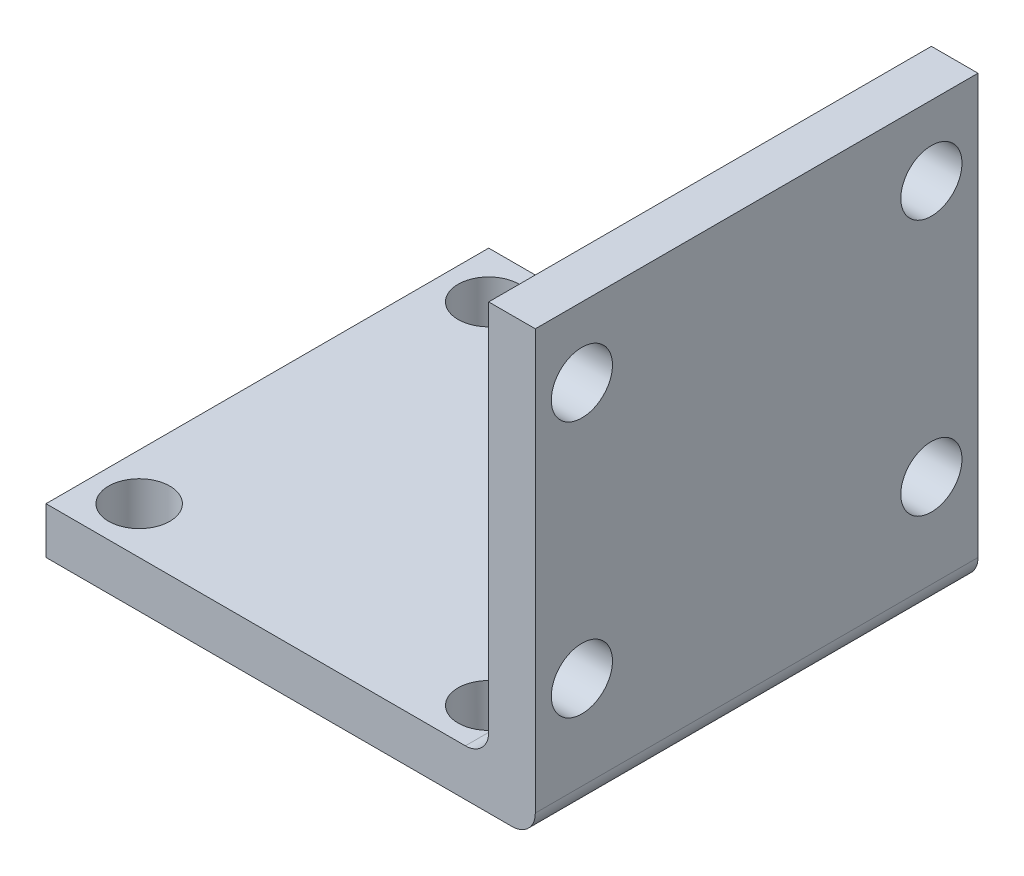
ISO-10303-21;
HEADER;
FILE_DESCRIPTION(('STEP AP214'),'2;1');
FILE_NAME('part.step','',(''),(''),'','','');
FILE_SCHEMA(('AUTOMOTIVE_DESIGN { 1 0 10303 214 1 1 1 1 }'));
ENDSEC;
DATA;
#1=APPLICATION_CONTEXT('core data for automotive mechanical design processes');
#2=APPLICATION_PROTOCOL_DEFINITION('international standard','automotive_design',2000,#1);
#3=PRODUCT_CONTEXT('',#1,'mechanical');
#4=PRODUCT('Part','Part','',(#3));
#5=PRODUCT_RELATED_PRODUCT_CATEGORY('part','',(#4));
#6=PRODUCT_DEFINITION_FORMATION('','',#4);
#7=PRODUCT_DEFINITION_CONTEXT('part definition',#1,'design');
#8=PRODUCT_DEFINITION('design','',#6,#7);
#9=PRODUCT_DEFINITION_SHAPE('','',#8);
#10=(LENGTH_UNIT() NAMED_UNIT(*) SI_UNIT(.MILLI.,.METRE.));
#11=(NAMED_UNIT(*) PLANE_ANGLE_UNIT() SI_UNIT($,.RADIAN.));
#12=(NAMED_UNIT(*) SI_UNIT($,.STERADIAN.) SOLID_ANGLE_UNIT());
#13=UNCERTAINTY_MEASURE_WITH_UNIT(LENGTH_MEASURE(1.E-05),#10,'distance_accuracy_value','');
#14=(GEOMETRIC_REPRESENTATION_CONTEXT(3) GLOBAL_UNCERTAINTY_ASSIGNED_CONTEXT((#13)) GLOBAL_UNIT_ASSIGNED_CONTEXT((#10,
#11,#12)) REPRESENTATION_CONTEXT('',''));
#15=CARTESIAN_POINT('',(0.,0.,0.));
#16=DIRECTION('',(0.,0.,1.));
#17=DIRECTION('',(1.,0.,0.));
#18=AXIS2_PLACEMENT_3D('',#15,#16,#17);
#19=CARTESIAN_POINT('',(0.,25.4,0.));
#20=DIRECTION('',(1.,0.,0.));
#21=DIRECTION('',(0.,0.,-1.));
#22=AXIS2_PLACEMENT_3D('',#19,#20,#21);
#23=PLANE('',#22);
#24=DIRECTION('',(0.,0.,1.));
#25=VECTOR('',#24,1.);
#26=CARTESIAN_POINT('',(0.,0.,0.));
#27=LINE('',#26,#25);
#28=CARTESIAN_POINT('',(0.,0.,0.));
#29=VERTEX_POINT('',#28);
#30=CARTESIAN_POINT('',(0.,0.,241.3));
#31=VERTEX_POINT('',#30);
#32=EDGE_CURVE('E224',#29,#31,#27,.T.);
#33=ORIENTED_EDGE('',*,*,#32,.T.);
#34=DIRECTION('',(0.,-1.,0.));
#35=VECTOR('',#34,1.);
#36=CARTESIAN_POINT('',(0.,25.4,241.3));
#37=LINE('',#36,#35);
#38=CARTESIAN_POINT('',(0.,25.4,241.3));
#39=VERTEX_POINT('',#38);
#40=EDGE_CURVE('E207',#39,#31,#37,.T.);
#41=ORIENTED_EDGE('',*,*,#40,.F.);
#42=DIRECTION('',(0.,0.,1.));
#43=VECTOR('',#42,1.);
#44=CARTESIAN_POINT('',(0.,25.4,0.));
#45=LINE('',#44,#43);
#46=CARTESIAN_POINT('',(0.,25.4,0.));
#47=VERTEX_POINT('',#46);
#48=EDGE_CURVE('E221',#47,#39,#45,.T.);
#49=ORIENTED_EDGE('',*,*,#48,.F.);
#50=DIRECTION('',(0.,-1.,0.));
#51=VECTOR('',#50,1.);
#52=CARTESIAN_POINT('',(0.,25.4,0.));
#53=LINE('',#52,#51);
#54=EDGE_CURVE('E215',#47,#29,#53,.T.);
#55=ORIENTED_EDGE('',*,*,#54,.T.);
#56=EDGE_LOOP('',(#33,#41,#49,#55));
#57=FACE_BOUND('',#56,.T.);
#58=ADVANCED_FACE('F33',(#57),#23,.F.);
#59=CARTESIAN_POINT('',(0.,25.4,241.3));
#60=DIRECTION('',(0.,0.,-1.));
#61=DIRECTION('',(-1.,0.,0.));
#62=AXIS2_PLACEMENT_3D('',#59,#60,#61);
#63=PLANE('',#62);
#64=DIRECTION('',(1.,0.,0.));
#65=VECTOR('',#64,1.);
#66=CARTESIAN_POINT('',(0.,0.,241.3));
#67=LINE('',#66,#65);
#68=CARTESIAN_POINT('',(254.,0.,241.3));
#69=VERTEX_POINT('',#68);
#70=EDGE_CURVE('E222',#31,#69,#67,.T.);
#71=ORIENTED_EDGE('',*,*,#70,.T.);
#72=CARTESIAN_POINT('',(254.,12.7,241.3));
#73=DIRECTION('',(0.,0.,-1.));
#74=DIRECTION('',(-1.,0.,0.));
#75=AXIS2_PLACEMENT_3D('',#72,#73,#74);
#76=CIRCLE('',#75,12.7);
#77=CARTESIAN_POINT('',(266.7,12.7,241.3));
#78=VERTEX_POINT('',#77);
#79=EDGE_CURVE('E131',#69,#78,#76,.F.);
#80=ORIENTED_EDGE('',*,*,#79,.T.);
#81=DIRECTION('',(0.,-1.,0.));
#82=VECTOR('',#81,1.);
#83=CARTESIAN_POINT('',(266.7,25.4,241.3));
#84=LINE('',#83,#82);
#85=CARTESIAN_POINT('',(266.7,241.3,241.3));
#86=VERTEX_POINT('',#85);
#87=EDGE_CURVE('E210',#86,#78,#84,.T.);
#88=ORIENTED_EDGE('',*,*,#87,.F.);
#89=DIRECTION('',(1.,0.,0.));
#90=VECTOR('',#89,1.);
#91=CARTESIAN_POINT('',(266.7,241.3,241.3));
#92=LINE('',#91,#90);
#93=CARTESIAN_POINT('',(241.3,241.3,241.3));
#94=VERTEX_POINT('',#93);
#95=EDGE_CURVE('E237',#94,#86,#92,.T.);
#96=ORIENTED_EDGE('',*,*,#95,.F.);
#97=DIRECTION('',(0.,-1.,0.));
#98=VECTOR('',#97,1.);
#99=CARTESIAN_POINT('',(241.3,241.3,241.3));
#100=LINE('',#99,#98);
#101=CARTESIAN_POINT('',(241.3,38.1,241.3));
#102=VERTEX_POINT('',#101);
#103=EDGE_CURVE('E235',#94,#102,#100,.T.);
#104=ORIENTED_EDGE('',*,*,#103,.T.);
#105=CARTESIAN_POINT('',(228.6,38.1,241.3));
#106=DIRECTION('',(0.,0.,-1.));
#107=DIRECTION('',(-1.,0.,0.));
#108=AXIS2_PLACEMENT_3D('',#105,#106,#107);
#109=CIRCLE('',#108,12.7);
#110=CARTESIAN_POINT('',(228.6,25.4,241.3));
#111=VERTEX_POINT('',#110);
#112=EDGE_CURVE('E135',#102,#111,#109,.T.);
#113=ORIENTED_EDGE('',*,*,#112,.T.);
#114=DIRECTION('',(1.,0.,0.));
#115=VECTOR('',#114,1.);
#116=CARTESIAN_POINT('',(0.,25.4,241.3));
#117=LINE('',#116,#115);
#118=EDGE_CURVE('E229',#39,#111,#117,.T.);
#119=ORIENTED_EDGE('',*,*,#118,.F.);
#120=ORIENTED_EDGE('',*,*,#40,.T.);
#121=EDGE_LOOP('',(#71,#80,#88,#96,#104,#113,#119,#120));
#122=FACE_BOUND('',#121,.T.);
#123=ADVANCED_FACE('F182',(#122),#63,.F.);
#124=CARTESIAN_POINT('',(266.7,25.4,0.));
#125=DIRECTION('',(-1.,0.,0.));
#126=DIRECTION('',(0.,0.,1.));
#127=AXIS2_PLACEMENT_3D('',#124,#125,#126);
#128=PLANE('',#127);
#129=CARTESIAN_POINT('',(266.7,203.2,25.4));
#130=DIRECTION('',(-1.,0.,0.));
#131=DIRECTION('',(0.,0.,1.));
#132=AXIS2_PLACEMENT_3D('',#129,#130,#131);
#133=CIRCLE('',#132,16.6751);
#134=CARTESIAN_POINT('',(266.7,203.2,42.0751));
#135=VERTEX_POINT('',#134);
#136=EDGE_CURVE('E275',#135,#135,#133,.T.);
#137=ORIENTED_EDGE('',*,*,#136,.T.);
#138=EDGE_LOOP('',(#137));
#139=FACE_BOUND('',#138,.T.);
#140=CARTESIAN_POINT('',(266.7,63.5,215.9));
#141=DIRECTION('',(-1.,0.,0.));
#142=DIRECTION('',(0.,0.,1.));
#143=AXIS2_PLACEMENT_3D('',#140,#141,#142);
#144=CIRCLE('',#143,16.6751);
#145=CARTESIAN_POINT('',(266.7,63.5,232.5751));
#146=VERTEX_POINT('',#145);
#147=EDGE_CURVE('E272',#146,#146,#144,.T.);
#148=ORIENTED_EDGE('',*,*,#147,.T.);
#149=EDGE_LOOP('',(#148));
#150=FACE_BOUND('',#149,.T.);
#151=CARTESIAN_POINT('',(266.7,203.2,215.9));
#152=DIRECTION('',(-1.,0.,0.));
#153=DIRECTION('',(0.,0.,1.));
#154=AXIS2_PLACEMENT_3D('',#151,#152,#153);
#155=CIRCLE('',#154,16.6751);
#156=CARTESIAN_POINT('',(266.7,203.2,232.5751));
#157=VERTEX_POINT('',#156);
#158=EDGE_CURVE('E269',#157,#157,#155,.T.);
#159=ORIENTED_EDGE('',*,*,#158,.T.);
#160=EDGE_LOOP('',(#159));
#161=FACE_BOUND('',#160,.T.);
#162=CARTESIAN_POINT('',(266.7,63.5,25.4));
#163=DIRECTION('',(-1.,0.,0.));
#164=DIRECTION('',(0.,0.,1.));
#165=AXIS2_PLACEMENT_3D('',#162,#163,#164);
#166=CIRCLE('',#165,16.6751);
#167=CARTESIAN_POINT('',(266.7,63.5,42.0751));
#168=VERTEX_POINT('',#167);
#169=EDGE_CURVE('E266',#168,#168,#166,.T.);
#170=ORIENTED_EDGE('',*,*,#169,.T.);
#171=EDGE_LOOP('',(#170));
#172=FACE_BOUND('',#171,.T.);
#173=ORIENTED_EDGE('',*,*,#87,.T.);
#174=DIRECTION('',(0.,0.,-1.));
#175=VECTOR('',#174,1.);
#176=CARTESIAN_POINT('',(266.7,12.7,0.));
#177=LINE('',#176,#175);
#178=CARTESIAN_POINT('',(266.7,12.7,0.));
#179=VERTEX_POINT('',#178);
#180=EDGE_CURVE('E198',#78,#179,#177,.T.);
#181=ORIENTED_EDGE('',*,*,#180,.T.);
#182=DIRECTION('',(0.,-1.,0.));
#183=VECTOR('',#182,1.);
#184=CARTESIAN_POINT('',(266.7,25.4,0.));
#185=LINE('',#184,#183);
#186=CARTESIAN_POINT('',(266.7,241.3,0.));
#187=VERTEX_POINT('',#186);
#188=EDGE_CURVE('E212',#187,#179,#185,.T.);
#189=ORIENTED_EDGE('',*,*,#188,.F.);
#190=DIRECTION('',(0.,0.,-1.));
#191=VECTOR('',#190,1.);
#192=CARTESIAN_POINT('',(266.7,241.3,0.));
#193=LINE('',#192,#191);
#194=EDGE_CURVE('E244',#86,#187,#193,.T.);
#195=ORIENTED_EDGE('',*,*,#194,.F.);
#196=EDGE_LOOP('',(#173,#181,#189,#195));
#197=FACE_BOUND('',#196,.T.);
#198=ADVANCED_FACE('F178',(#139,#150,#161,#172,#197),#128,.F.);
#199=CARTESIAN_POINT('',(0.,25.4,0.));
#200=DIRECTION('',(0.,0.,1.));
#201=DIRECTION('',(1.,0.,0.));
#202=AXIS2_PLACEMENT_3D('',#199,#200,#201);
#203=PLANE('',#202);
#204=ORIENTED_EDGE('',*,*,#188,.T.);
#205=CARTESIAN_POINT('',(254.,12.7,0.));
#206=DIRECTION('',(0.,0.,1.));
#207=DIRECTION('',(1.,0.,0.));
#208=AXIS2_PLACEMENT_3D('',#205,#206,#207);
#209=CIRCLE('',#208,12.7);
#210=CARTESIAN_POINT('',(254.,0.,0.));
#211=VERTEX_POINT('',#210);
#212=EDGE_CURVE('E202',#179,#211,#209,.F.);
#213=ORIENTED_EDGE('',*,*,#212,.T.);
#214=DIRECTION('',(-1.,0.,0.));
#215=VECTOR('',#214,1.);
#216=CARTESIAN_POINT('',(0.,0.,0.));
#217=LINE('',#216,#215);
#218=EDGE_CURVE('E219',#211,#29,#217,.T.);
#219=ORIENTED_EDGE('',*,*,#218,.T.);
#220=ORIENTED_EDGE('',*,*,#54,.F.);
#221=DIRECTION('',(-1.,0.,0.));
#222=VECTOR('',#221,1.);
#223=CARTESIAN_POINT('',(0.,25.4,0.));
#224=LINE('',#223,#222);
#225=CARTESIAN_POINT('',(228.6,25.4,0.));
#226=VERTEX_POINT('',#225);
#227=EDGE_CURVE('E218',#226,#47,#224,.T.);
#228=ORIENTED_EDGE('',*,*,#227,.F.);
#229=CARTESIAN_POINT('',(228.6,38.1,0.));
#230=DIRECTION('',(0.,0.,1.));
#231=DIRECTION('',(1.,0.,0.));
#232=AXIS2_PLACEMENT_3D('',#229,#230,#231);
#233=CIRCLE('',#232,12.7);
#234=CARTESIAN_POINT('',(241.3,38.1,0.));
#235=VERTEX_POINT('',#234);
#236=EDGE_CURVE('E115',#226,#235,#233,.T.);
#237=ORIENTED_EDGE('',*,*,#236,.T.);
#238=DIRECTION('',(0.,-1.,0.));
#239=VECTOR('',#238,1.);
#240=CARTESIAN_POINT('',(241.3,241.3,0.));
#241=LINE('',#240,#239);
#242=CARTESIAN_POINT('',(241.3,241.3,0.));
#243=VERTEX_POINT('',#242);
#244=EDGE_CURVE('E227',#243,#235,#241,.T.);
#245=ORIENTED_EDGE('',*,*,#244,.F.);
#246=DIRECTION('',(-1.,0.,0.));
#247=VECTOR('',#246,1.);
#248=CARTESIAN_POINT('',(266.7,241.3,0.));
#249=LINE('',#248,#247);
#250=EDGE_CURVE('E242',#187,#243,#249,.T.);
#251=ORIENTED_EDGE('',*,*,#250,.F.);
#252=EDGE_LOOP('',(#204,#213,#219,#220,#228,#237,#245,#251));
#253=FACE_BOUND('',#252,.T.);
#254=ADVANCED_FACE('F172',(#253),#203,.F.);
#255=CARTESIAN_POINT('',(0.,25.4,0.));
#256=DIRECTION('',(0.,1.,0.));
#257=DIRECTION('',(0.,0.,1.));
#258=AXIS2_PLACEMENT_3D('',#255,#256,#257);
#259=PLANE('',#258);
#260=CARTESIAN_POINT('',(215.9,25.4,215.9));
#261=DIRECTION('',(0.,1.,0.));
#262=DIRECTION('',(0.,0.,1.));
#263=AXIS2_PLACEMENT_3D('',#260,#261,#262);
#264=CIRCLE('',#263,16.6751);
#265=CARTESIAN_POINT('',(228.6,25.4,205.094031278502));
#266=VERTEX_POINT('',#265);
#267=CARTESIAN_POINT('',(228.6,25.4,226.705968721498));
#268=VERTEX_POINT('',#267);
#269=EDGE_CURVE('E57',#266,#268,#264,.T.);
#270=ORIENTED_EDGE('',*,*,#269,.F.);
#271=DIRECTION('',(0.,0.,1.));
#272=VECTOR('',#271,1.);
#273=CARTESIAN_POINT('',(228.6,25.4,0.));
#274=LINE('',#273,#272);
#275=CARTESIAN_POINT('',(228.6,25.4,36.2059687214983));
#276=VERTEX_POINT('',#275);
#277=EDGE_CURVE('E122',#266,#276,#274,.F.);
#278=ORIENTED_EDGE('',*,*,#277,.T.);
#279=CARTESIAN_POINT('',(215.9,25.4,25.4));
#280=DIRECTION('',(0.,1.,0.));
#281=DIRECTION('',(0.,0.,1.));
#282=AXIS2_PLACEMENT_3D('',#279,#280,#281);
#283=CIRCLE('',#282,16.6751);
#284=CARTESIAN_POINT('',(228.6,25.4,14.5940312785017));
#285=VERTEX_POINT('',#284);
#286=EDGE_CURVE('E50',#285,#276,#283,.T.);
#287=ORIENTED_EDGE('',*,*,#286,.F.);
#288=EDGE_CURVE('E120',#285,#226,#274,.F.);
#289=ORIENTED_EDGE('',*,*,#288,.T.);
#290=ORIENTED_EDGE('',*,*,#227,.T.);
#291=ORIENTED_EDGE('',*,*,#48,.T.);
#292=ORIENTED_EDGE('',*,*,#118,.T.);
#293=EDGE_CURVE('E129',#111,#268,#274,.F.);
#294=ORIENTED_EDGE('',*,*,#293,.T.);
#295=EDGE_LOOP('',(#270,#278,#287,#289,#290,#291,#292,#294));
#296=FACE_BOUND('',#295,.T.);
#297=CARTESIAN_POINT('',(25.3999999999999,25.4,25.4));
#298=DIRECTION('',(0.,1.,0.));
#299=DIRECTION('',(0.,0.,1.));
#300=AXIS2_PLACEMENT_3D('',#297,#298,#299);
#301=CIRCLE('',#300,16.6751);
#302=CARTESIAN_POINT('',(25.3999999999999,25.4,42.0751));
#303=VERTEX_POINT('',#302);
#304=EDGE_CURVE('E253',#303,#303,#301,.T.);
#305=ORIENTED_EDGE('',*,*,#304,.F.);
#306=EDGE_LOOP('',(#305));
#307=FACE_BOUND('',#306,.T.);
#308=CARTESIAN_POINT('',(25.3999999999999,25.4,215.9));
#309=DIRECTION('',(0.,1.,0.));
#310=DIRECTION('',(0.,0.,1.));
#311=AXIS2_PLACEMENT_3D('',#308,#309,#310);
#312=CIRCLE('',#311,16.6751);
#313=CARTESIAN_POINT('',(25.3999999999999,25.4,232.5751));
#314=VERTEX_POINT('',#313);
#315=EDGE_CURVE('E247',#314,#314,#312,.T.);
#316=ORIENTED_EDGE('',*,*,#315,.F.);
#317=EDGE_LOOP('',(#316));
#318=FACE_BOUND('',#317,.T.);
#319=ADVANCED_FACE('F118',(#296,#307,#318),#259,.T.);
#320=CARTESIAN_POINT('',(0.,0.,0.));
#321=DIRECTION('',(0.,1.,0.));
#322=DIRECTION('',(0.,0.,1.));
#323=AXIS2_PLACEMENT_3D('',#320,#321,#322);
#324=PLANE('',#323);
#325=CARTESIAN_POINT('',(215.9,0.,215.9));
#326=DIRECTION('',(0.,1.,0.));
#327=DIRECTION('',(0.,0.,1.));
#328=AXIS2_PLACEMENT_3D('',#325,#326,#327);
#329=CIRCLE('',#328,16.6751);
#330=CARTESIAN_POINT('',(215.9,0.,232.5751));
#331=VERTEX_POINT('',#330);
#332=EDGE_CURVE('E123',#331,#331,#329,.T.);
#333=ORIENTED_EDGE('',*,*,#332,.T.);
#334=EDGE_LOOP('',(#333));
#335=FACE_BOUND('',#334,.T.);
#336=CARTESIAN_POINT('',(25.3999999999999,0.,25.4));
#337=DIRECTION('',(0.,1.,0.));
#338=DIRECTION('',(0.,0.,1.));
#339=AXIS2_PLACEMENT_3D('',#336,#337,#338);
#340=CIRCLE('',#339,16.6751);
#341=CARTESIAN_POINT('',(25.3999999999999,0.,42.0751));
#342=VERTEX_POINT('',#341);
#343=EDGE_CURVE('E260',#342,#342,#340,.T.);
#344=ORIENTED_EDGE('',*,*,#343,.T.);
#345=EDGE_LOOP('',(#344));
#346=FACE_BOUND('',#345,.T.);
#347=CARTESIAN_POINT('',(215.9,0.,25.4));
#348=DIRECTION('',(0.,1.,0.));
#349=DIRECTION('',(0.,0.,1.));
#350=AXIS2_PLACEMENT_3D('',#347,#348,#349);
#351=CIRCLE('',#350,16.6751);
#352=CARTESIAN_POINT('',(215.9,0.,42.0751));
#353=VERTEX_POINT('',#352);
#354=EDGE_CURVE('E257',#353,#353,#351,.T.);
#355=ORIENTED_EDGE('',*,*,#354,.T.);
#356=EDGE_LOOP('',(#355));
#357=FACE_BOUND('',#356,.T.);
#358=CARTESIAN_POINT('',(25.3999999999999,0.,215.9));
#359=DIRECTION('',(0.,1.,0.));
#360=DIRECTION('',(0.,0.,1.));
#361=AXIS2_PLACEMENT_3D('',#358,#359,#360);
#362=CIRCLE('',#361,16.6751);
#363=CARTESIAN_POINT('',(25.3999999999999,0.,232.5751));
#364=VERTEX_POINT('',#363);
#365=EDGE_CURVE('E250',#364,#364,#362,.T.);
#366=ORIENTED_EDGE('',*,*,#365,.T.);
#367=EDGE_LOOP('',(#366));
#368=FACE_BOUND('',#367,.T.);
#369=ORIENTED_EDGE('',*,*,#218,.F.);
#370=DIRECTION('',(0.,0.,-1.));
#371=VECTOR('',#370,1.);
#372=CARTESIAN_POINT('',(254.,0.,0.));
#373=LINE('',#372,#371);
#374=EDGE_CURVE('E196',#211,#69,#373,.F.);
#375=ORIENTED_EDGE('',*,*,#374,.T.);
#376=ORIENTED_EDGE('',*,*,#70,.F.);
#377=ORIENTED_EDGE('',*,*,#32,.F.);
#378=EDGE_LOOP('',(#369,#375,#376,#377));
#379=FACE_BOUND('',#378,.T.);
#380=ADVANCED_FACE('F168',(#335,#346,#357,#368,#379),#324,.F.);
#381=CARTESIAN_POINT('',(241.3,241.3,0.));
#382=DIRECTION('',(1.,0.,0.));
#383=DIRECTION('',(0.,0.,-1.));
#384=AXIS2_PLACEMENT_3D('',#381,#382,#383);
#385=PLANE('',#384);
#386=CARTESIAN_POINT('',(241.3,203.2,25.4));
#387=DIRECTION('',(1.,0.,0.));
#388=DIRECTION('',(0.,0.,-1.));
#389=AXIS2_PLACEMENT_3D('',#386,#387,#388);
#390=CIRCLE('',#389,16.6751);
#391=CARTESIAN_POINT('',(241.3,203.2,8.72489999999997));
#392=VERTEX_POINT('',#391);
#393=EDGE_CURVE('E38',#392,#392,#390,.T.);
#394=ORIENTED_EDGE('',*,*,#393,.T.);
#395=EDGE_LOOP('',(#394));
#396=FACE_BOUND('',#395,.T.);
#397=CARTESIAN_POINT('',(241.3,63.5,215.9));
#398=DIRECTION('',(1.,0.,0.));
#399=DIRECTION('',(0.,0.,-1.));
#400=AXIS2_PLACEMENT_3D('',#397,#398,#399);
#401=CIRCLE('',#400,16.6751);
#402=CARTESIAN_POINT('',(241.3,63.5,199.2249));
#403=VERTEX_POINT('',#402);
#404=EDGE_CURVE('E280',#403,#403,#401,.T.);
#405=ORIENTED_EDGE('',*,*,#404,.T.);
#406=EDGE_LOOP('',(#405));
#407=FACE_BOUND('',#406,.T.);
#408=CARTESIAN_POINT('',(241.3,203.2,215.9));
#409=DIRECTION('',(1.,0.,0.));
#410=DIRECTION('',(0.,0.,-1.));
#411=AXIS2_PLACEMENT_3D('',#408,#409,#410);
#412=CIRCLE('',#411,16.6751);
#413=CARTESIAN_POINT('',(241.3,203.2,199.2249));
#414=VERTEX_POINT('',#413);
#415=EDGE_CURVE('E277',#414,#414,#412,.T.);
#416=ORIENTED_EDGE('',*,*,#415,.T.);
#417=EDGE_LOOP('',(#416));
#418=FACE_BOUND('',#417,.T.);
#419=CARTESIAN_POINT('',(241.3,63.5,25.4));
#420=DIRECTION('',(1.,0.,0.));
#421=DIRECTION('',(0.,0.,-1.));
#422=AXIS2_PLACEMENT_3D('',#419,#420,#421);
#423=CIRCLE('',#422,16.6751);
#424=CARTESIAN_POINT('',(241.3,63.5,8.72489999999997));
#425=VERTEX_POINT('',#424);
#426=EDGE_CURVE('E261',#425,#425,#423,.T.);
#427=ORIENTED_EDGE('',*,*,#426,.T.);
#428=EDGE_LOOP('',(#427));
#429=FACE_BOUND('',#428,.T.);
#430=ORIENTED_EDGE('',*,*,#244,.T.);
#431=DIRECTION('',(0.,0.,1.));
#432=VECTOR('',#431,1.);
#433=CARTESIAN_POINT('',(241.3,38.1,0.));
#434=LINE('',#433,#432);
#435=EDGE_CURVE('E127',#235,#102,#434,.T.);
#436=ORIENTED_EDGE('',*,*,#435,.T.);
#437=ORIENTED_EDGE('',*,*,#103,.F.);
#438=DIRECTION('',(0.,0.,1.));
#439=VECTOR('',#438,1.);
#440=CARTESIAN_POINT('',(241.3,241.3,0.));
#441=LINE('',#440,#439);
#442=EDGE_CURVE('E240',#243,#94,#441,.T.);
#443=ORIENTED_EDGE('',*,*,#442,.F.);
#444=EDGE_LOOP('',(#430,#436,#437,#443));
#445=FACE_BOUND('',#444,.T.);
#446=ADVANCED_FACE('F164',(#396,#407,#418,#429,#445),#385,.F.);
#447=CARTESIAN_POINT('',(0.,241.3,0.));
#448=DIRECTION('',(0.,-1.,0.));
#449=DIRECTION('',(0.,0.,-1.));
#450=AXIS2_PLACEMENT_3D('',#447,#448,#449);
#451=PLANE('',#450);
#452=ORIENTED_EDGE('',*,*,#194,.T.);
#453=ORIENTED_EDGE('',*,*,#250,.T.);
#454=ORIENTED_EDGE('',*,*,#442,.T.);
#455=ORIENTED_EDGE('',*,*,#95,.T.);
#456=EDGE_LOOP('',(#452,#453,#454,#455));
#457=FACE_BOUND('',#456,.T.);
#458=ADVANCED_FACE('F160',(#457),#451,.F.);
#459=CARTESIAN_POINT('',(254.,12.7,0.));
#460=DIRECTION('',(0.,0.,-1.));
#461=DIRECTION('',(-1.,0.,0.));
#462=AXIS2_PLACEMENT_3D('',#459,#460,#461);
#463=CYLINDRICAL_SURFACE('',#462,12.7);
#464=ORIENTED_EDGE('',*,*,#79,.F.);
#465=ORIENTED_EDGE('',*,*,#374,.F.);
#466=ORIENTED_EDGE('',*,*,#212,.F.);
#467=ORIENTED_EDGE('',*,*,#180,.F.);
#468=EDGE_LOOP('',(#464,#465,#466,#467));
#469=FACE_BOUND('',#468,.T.);
#470=ADVANCED_FACE('F163',(#469),#463,.T.);
#471=CARTESIAN_POINT('',(228.6,38.1,0.));
#472=DIRECTION('',(0.,0.,1.));
#473=DIRECTION('',(1.,0.,0.));
#474=AXIS2_PLACEMENT_3D('',#471,#472,#473);
#475=CYLINDRICAL_SURFACE('',#474,12.7);
#476=ORIENTED_EDGE('',*,*,#277,.F.);
#477=CARTESIAN_POINT('',(228.6,25.4,205.094031278502));
#478=CARTESIAN_POINT('',(228.748638665477,25.4000028529839,205.268720481792));
#479=CARTESIAN_POINT('',(228.893641599045,25.4026091280366,205.446445185434));
#480=CARTESIAN_POINT('',(229.176121334364,25.4122867272648,205.807621020647));
#481=CARTESIAN_POINT('',(229.313599252627,25.4193573870824,205.991071296319));
#482=CARTESIAN_POINT('',(229.714189917119,25.4461389695309,206.549240923372));
#483=CARTESIAN_POINT('',(229.965725615038,25.4714221514406,206.932091924292));
#484=CARTESIAN_POINT('',(230.436303070059,25.5312166301806,207.716820780886));
#485=CARTESIAN_POINT('',(230.655322160142,25.5657343177668,208.11871165403));
#486=CARTESIAN_POINT('',(231.059524359963,25.6387428642707,208.938907340355));
#487=CARTESIAN_POINT('',(231.244701530351,25.6772344187614,209.357215019112));
#488=CARTESIAN_POINT('',(231.579903002101,25.7533525110392,210.207191251521));
#489=CARTESIAN_POINT('',(231.729968068196,25.7909800057351,210.638843646017));
#490=CARTESIAN_POINT('',(231.994255755082,25.8612196141729,211.513370425346));
#491=CARTESIAN_POINT('',(232.108480698626,25.8938320528641,211.956244080933));
#492=CARTESIAN_POINT('',(232.300125220008,25.9505525646391,212.849854257006));
#493=CARTESIAN_POINT('',(232.377590973873,25.9746712974368,213.300580171453));
#494=CARTESIAN_POINT('',(232.495265039619,26.0119588289649,214.207329993587));
#495=CARTESIAN_POINT('',(232.535473739743,26.0251277417995,214.663353846016));
#496=CARTESIAN_POINT('',(232.578387557448,26.0391974271138,215.580209995312));
#497=CARTESIAN_POINT('',(232.580857450689,26.0400212525898,216.041054548804));
#498=CARTESIAN_POINT('',(232.547664393457,26.029115907248,216.961223174793));
#499=CARTESIAN_POINT('',(232.512000563252,26.0173864468304,217.420547211967));
#500=CARTESIAN_POINT('',(232.402808129745,25.9825778758677,218.334864993382));
#501=CARTESIAN_POINT('',(232.329227285688,25.959483108575,218.789851878886));
#502=CARTESIAN_POINT('',(232.144823690641,25.9043671872923,219.691632449904));
#503=CARTESIAN_POINT('',(232.034001888139,25.8723462606457,220.138426343779));
#504=CARTESIAN_POINT('',(231.778375654418,25.8034520074323,221.012701735599));
#505=CARTESIAN_POINT('',(231.634242125681,25.7666800904956,221.440387905527));
#506=CARTESIAN_POINT('',(231.311820760031,25.6918009320959,222.282640516887));
#507=CARTESIAN_POINT('',(231.133527862663,25.6536934934696,222.697205003822));
#508=CARTESIAN_POINT('',(230.744245759307,25.5807615662333,223.509854892572));
#509=CARTESIAN_POINT('',(230.533329374486,25.5459300371214,223.907974553414));
#510=CARTESIAN_POINT('',(230.079746437603,25.4844272644689,224.686146514816));
#511=CARTESIAN_POINT('',(229.837098485734,25.4577512707126,225.066209223319));
#512=CARTESIAN_POINT('',(229.426432791498,25.4259906799266,225.655310174803));
#513=CARTESIAN_POINT('',(229.268226686913,25.4165372279823,225.871007663655));
#514=CARTESIAN_POINT('',(228.941657349455,25.403546808939,226.294499087156));
#515=CARTESIAN_POINT('',(228.773301619342,25.4000055257135,226.502298679194));
#516=CARTESIAN_POINT('',(228.6,25.4,226.705968721498));
#517=B_SPLINE_CURVE_WITH_KNOTS('',3,(#477,#478,#479,#480,#481,#482,#483,#484,#485,#486,#487,
#488,#489,#490,#491,#492,#493,#494,#495,#496,#497,#498,#499,#500,#501,#502,#503,#504,#505,#506,
#507,#508,#509,#510,#511,#512,#513,#514,#515,#516),.UNSPECIFIED.,.F.,.F.,(4,2,2,2,2,2,2,2,2,2,2,
2,2,2,2,2,2,2,2,4),(0.,0.68796204313846,1.37582173280543,2.75031355056788,4.12575905953246,
5.50144573159646,6.87552723381388,8.24951966517272,9.62178152044119,10.9940290756549,
12.3748263253893,13.7556554303254,15.1383921009144,16.5210935573537,17.8780591439276,
19.2352259105126,20.589405842026,21.9427955181016,22.7454465519304,23.5475113608264),.UNSPECIFIED.);
#518=EDGE_CURVE('E11',#266,#268,#517,.T.);
#519=ORIENTED_EDGE('',*,*,#518,.T.);
#520=ORIENTED_EDGE('',*,*,#293,.F.);
#521=ORIENTED_EDGE('',*,*,#112,.F.);
#522=ORIENTED_EDGE('',*,*,#435,.F.);
#523=ORIENTED_EDGE('',*,*,#236,.F.);
#524=ORIENTED_EDGE('',*,*,#288,.F.);
#525=CARTESIAN_POINT('',(228.6,25.4,14.5940312785017));
#526=CARTESIAN_POINT('',(228.748638665477,25.4000028529839,14.7687204817919));
#527=CARTESIAN_POINT('',(228.893641599045,25.4026091280366,14.9464451854335));
#528=CARTESIAN_POINT('',(229.176121334364,25.4122867272648,15.3076210206468));
#529=CARTESIAN_POINT('',(229.313599252627,25.4193573870824,15.4910712963192));
#530=CARTESIAN_POINT('',(229.714189917119,25.4461389695309,16.0492409233721));
#531=CARTESIAN_POINT('',(229.965725615038,25.4714221514406,16.4320919242916));
#532=CARTESIAN_POINT('',(230.436303070059,25.5312166301806,17.2168207808862));
#533=CARTESIAN_POINT('',(230.655322160142,25.5657343177668,17.6187116540301));
#534=CARTESIAN_POINT('',(231.059524359963,25.6387428642707,18.4389073403552));
#535=CARTESIAN_POINT('',(231.244701530351,25.6772344187614,18.8572150191119));
#536=CARTESIAN_POINT('',(231.579903002101,25.7533525110392,19.707191251521));
#537=CARTESIAN_POINT('',(231.729968068196,25.7909800057351,20.1388436460168));
#538=CARTESIAN_POINT('',(231.994255755082,25.8612196141729,21.0133704253462));
#539=CARTESIAN_POINT('',(232.108480698626,25.8938320528641,21.4562440809329));
#540=CARTESIAN_POINT('',(232.300125220008,25.9505525646391,22.3498542570062));
#541=CARTESIAN_POINT('',(232.377590973873,25.9746712974368,22.8005801714531));
#542=CARTESIAN_POINT('',(232.495265039619,26.0119588289649,23.7073299935868));
#543=CARTESIAN_POINT('',(232.535473739743,26.0251277417995,24.1633538460155));
#544=CARTESIAN_POINT('',(232.578387557448,26.0391974271139,25.0802099953123));
#545=CARTESIAN_POINT('',(232.58085745069,26.0400212525898,25.5410545488038));
#546=CARTESIAN_POINT('',(232.547664393457,26.0291159072481,26.4612231747927));
#547=CARTESIAN_POINT('',(232.512000563252,26.0173864468304,26.9205472119669));
#548=CARTESIAN_POINT('',(232.402808129745,25.9825778758678,27.8348649933823));
#549=CARTESIAN_POINT('',(232.329227285688,25.959483108575,28.2898518788862));
#550=CARTESIAN_POINT('',(232.144823690641,25.9043671872924,29.1916324499038));
#551=CARTESIAN_POINT('',(232.034001888139,25.8723462606457,29.6384263437786));
#552=CARTESIAN_POINT('',(231.778375654418,25.8034520074324,30.5127017355993));
#553=CARTESIAN_POINT('',(231.634242125681,25.7666800904956,30.9403879055272));
#554=CARTESIAN_POINT('',(231.311820760031,25.6918009320959,31.7826405168866));
#555=CARTESIAN_POINT('',(231.133527862663,25.6536934934696,32.1972050038225));
#556=CARTESIAN_POINT('',(230.744245759307,25.5807615662333,33.0098548925717));
#557=CARTESIAN_POINT('',(230.533329374486,25.5459300371214,33.4079745534145));
#558=CARTESIAN_POINT('',(230.079746437603,25.484427264469,34.1861465148159));
#559=CARTESIAN_POINT('',(229.837098485735,25.4577512707126,34.5662092233193));
#560=CARTESIAN_POINT('',(229.426432791498,25.4259906799266,35.1553101748029));
#561=CARTESIAN_POINT('',(229.268226686913,25.4165372279823,35.3710076636547));
#562=CARTESIAN_POINT('',(228.941657349455,25.403546808939,35.7944990871562));
#563=CARTESIAN_POINT('',(228.773301619342,25.4000055257135,36.0022986791941));
#564=CARTESIAN_POINT('',(228.6,25.4,36.2059687214983));
#565=B_SPLINE_CURVE_WITH_KNOTS('',3,(#525,#526,#527,#528,#529,#530,#531,#532,#533,#534,#535,
#536,#537,#538,#539,#540,#541,#542,#543,#544,#545,#546,#547,#548,#549,#550,#551,#552,#553,#554,
#555,#556,#557,#558,#559,#560,#561,#562,#563,#564),.UNSPECIFIED.,.F.,.F.,(4,2,2,2,2,2,2,2,2,2,2,
2,2,2,2,2,2,2,2,4),(0.,0.687962043138452,1.37582173280542,2.75031355056786,4.12575905953247,
5.50144573159648,6.87552723381391,8.24951966517277,9.62178152044124,10.994029075655,
12.3748263253893,13.7556554303255,15.1383921009144,16.5210935573538,17.8780591439276,
19.2352259105126,20.589405842026,21.9427955181017,22.7454465519305,23.5475113608266),.UNSPECIFIED.);
#566=EDGE_CURVE('E43',#285,#276,#565,.T.);
#567=ORIENTED_EDGE('',*,*,#566,.T.);
#568=EDGE_LOOP('',(#476,#519,#520,#521,#522,#523,#524,#567));
#569=FACE_BOUND('',#568,.T.);
#570=ADVANCED_FACE('F35',(#569),#475,.F.);
#571=CARTESIAN_POINT('',(25.3999999999999,0.,215.9));
#572=DIRECTION('',(0.,1.,0.));
#573=DIRECTION('',(0.,0.,1.));
#574=AXIS2_PLACEMENT_3D('',#571,#572,#573);
#575=CYLINDRICAL_SURFACE('',#574,16.6751);
#576=ORIENTED_EDGE('',*,*,#315,.T.);
#577=EDGE_LOOP('',(#576));
#578=FACE_BOUND('',#577,.T.);
#579=ORIENTED_EDGE('',*,*,#365,.F.);
#580=EDGE_LOOP('',(#579));
#581=FACE_BOUND('',#580,.T.);
#582=ADVANCED_FACE('F155',(#578,#581),#575,.F.);
#583=CARTESIAN_POINT('',(215.9,0.,25.4));
#584=DIRECTION('',(0.,1.,0.));
#585=DIRECTION('',(0.,0.,1.));
#586=AXIS2_PLACEMENT_3D('',#583,#584,#585);
#587=CYLINDRICAL_SURFACE('',#586,16.6751);
#588=ORIENTED_EDGE('',*,*,#286,.T.);
#589=ORIENTED_EDGE('',*,*,#566,.F.);
#590=EDGE_LOOP('',(#588,#589));
#591=FACE_BOUND('',#590,.T.);
#592=ORIENTED_EDGE('',*,*,#354,.F.);
#593=EDGE_LOOP('',(#592));
#594=FACE_BOUND('',#593,.T.);
#595=ADVANCED_FACE('F109',(#591,#594),#587,.F.);
#596=CARTESIAN_POINT('',(215.9,0.,215.9));
#597=DIRECTION('',(0.,1.,0.));
#598=DIRECTION('',(0.,0.,1.));
#599=AXIS2_PLACEMENT_3D('',#596,#597,#598);
#600=CYLINDRICAL_SURFACE('',#599,16.6751);
#601=ORIENTED_EDGE('',*,*,#269,.T.);
#602=ORIENTED_EDGE('',*,*,#518,.F.);
#603=EDGE_LOOP('',(#601,#602));
#604=FACE_BOUND('',#603,.T.);
#605=ORIENTED_EDGE('',*,*,#332,.F.);
#606=EDGE_LOOP('',(#605));
#607=FACE_BOUND('',#606,.T.);
#608=ADVANCED_FACE('F154',(#604,#607),#600,.F.);
#609=CARTESIAN_POINT('',(25.3999999999999,0.,25.4));
#610=DIRECTION('',(0.,1.,0.));
#611=DIRECTION('',(0.,0.,1.));
#612=AXIS2_PLACEMENT_3D('',#609,#610,#611);
#613=CYLINDRICAL_SURFACE('',#612,16.6751);
#614=ORIENTED_EDGE('',*,*,#304,.T.);
#615=EDGE_LOOP('',(#614));
#616=FACE_BOUND('',#615,.T.);
#617=ORIENTED_EDGE('',*,*,#343,.F.);
#618=EDGE_LOOP('',(#617));
#619=FACE_BOUND('',#618,.T.);
#620=ADVANCED_FACE('F156',(#616,#619),#613,.F.);
#621=CARTESIAN_POINT('',(266.7,63.5,25.4));
#622=DIRECTION('',(-1.,0.,0.));
#623=DIRECTION('',(0.,0.,1.));
#624=AXIS2_PLACEMENT_3D('',#621,#622,#623);
#625=CYLINDRICAL_SURFACE('',#624,16.6751);
#626=ORIENTED_EDGE('',*,*,#169,.F.);
#627=EDGE_LOOP('',(#626));
#628=FACE_BOUND('',#627,.T.);
#629=ORIENTED_EDGE('',*,*,#426,.F.);
#630=EDGE_LOOP('',(#629));
#631=FACE_BOUND('',#630,.T.);
#632=ADVANCED_FACE('F290',(#628,#631),#625,.F.);
#633=CARTESIAN_POINT('',(266.7,203.2,215.9));
#634=DIRECTION('',(-1.,0.,0.));
#635=DIRECTION('',(0.,0.,1.));
#636=AXIS2_PLACEMENT_3D('',#633,#634,#635);
#637=CYLINDRICAL_SURFACE('',#636,16.6751);
#638=ORIENTED_EDGE('',*,*,#158,.F.);
#639=EDGE_LOOP('',(#638));
#640=FACE_BOUND('',#639,.T.);
#641=ORIENTED_EDGE('',*,*,#415,.F.);
#642=EDGE_LOOP('',(#641));
#643=FACE_BOUND('',#642,.T.);
#644=ADVANCED_FACE('F292',(#640,#643),#637,.F.);
#645=CARTESIAN_POINT('',(266.7,63.5,215.9));
#646=DIRECTION('',(-1.,0.,0.));
#647=DIRECTION('',(0.,0.,1.));
#648=AXIS2_PLACEMENT_3D('',#645,#646,#647);
#649=CYLINDRICAL_SURFACE('',#648,16.6751);
#650=ORIENTED_EDGE('',*,*,#147,.F.);
#651=EDGE_LOOP('',(#650));
#652=FACE_BOUND('',#651,.T.);
#653=ORIENTED_EDGE('',*,*,#404,.F.);
#654=EDGE_LOOP('',(#653));
#655=FACE_BOUND('',#654,.T.);
#656=ADVANCED_FACE('F299',(#652,#655),#649,.F.);
#657=CARTESIAN_POINT('',(266.7,203.2,25.4));
#658=DIRECTION('',(-1.,0.,0.));
#659=DIRECTION('',(0.,0.,1.));
#660=AXIS2_PLACEMENT_3D('',#657,#658,#659);
#661=CYLINDRICAL_SURFACE('',#660,16.6751);
#662=ORIENTED_EDGE('',*,*,#136,.F.);
#663=EDGE_LOOP('',(#662));
#664=FACE_BOUND('',#663,.T.);
#665=ORIENTED_EDGE('',*,*,#393,.F.);
#666=EDGE_LOOP('',(#665));
#667=FACE_BOUND('',#666,.T.);
#668=ADVANCED_FACE('F373',(#664,#667),#661,.F.);
#669=CLOSED_SHELL('',(#58,#123,#198,#254,#319,#380,#446,#458,#470,#570,#582,#595,#608,#620,#632,
#644,#656,#668));
#670=MANIFOLD_SOLID_BREP('B2',#669);
#671=ADVANCED_BREP_SHAPE_REPRESENTATION('',(#18,#670),#14);
#672=SHAPE_DEFINITION_REPRESENTATION(#9,#671);
ENDSEC;
END-ISO-10303-21;
